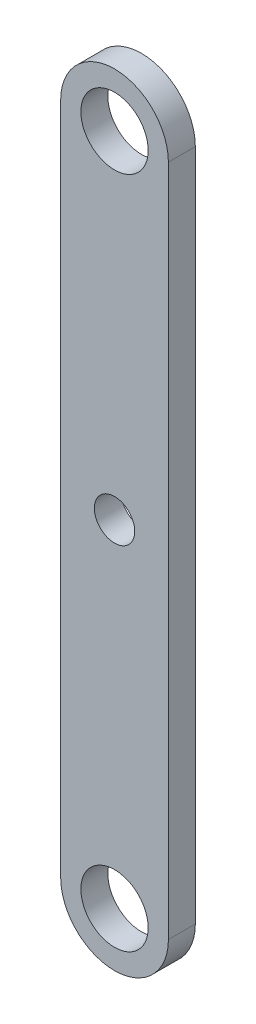
ISO-10303-21;
HEADER;
FILE_DESCRIPTION(('STEP AP214'),'2;1');
FILE_NAME('part.step','',(''),(''),'','','');
FILE_SCHEMA(('AUTOMOTIVE_DESIGN { 1 0 10303 214 1 1 1 1 }'));
ENDSEC;
DATA;
#1=APPLICATION_CONTEXT('core data for automotive mechanical design processes');
#2=APPLICATION_PROTOCOL_DEFINITION('international standard','automotive_design',2000,#1);
#3=PRODUCT_CONTEXT('',#1,'mechanical');
#4=PRODUCT('Part','Part','',(#3));
#5=PRODUCT_RELATED_PRODUCT_CATEGORY('part','',(#4));
#6=PRODUCT_DEFINITION_FORMATION('','',#4);
#7=PRODUCT_DEFINITION_CONTEXT('part definition',#1,'design');
#8=PRODUCT_DEFINITION('design','',#6,#7);
#9=PRODUCT_DEFINITION_SHAPE('','',#8);
#10=(LENGTH_UNIT() NAMED_UNIT(*) SI_UNIT(.MILLI.,.METRE.));
#11=(NAMED_UNIT(*) PLANE_ANGLE_UNIT() SI_UNIT($,.RADIAN.));
#12=(NAMED_UNIT(*) SI_UNIT($,.STERADIAN.) SOLID_ANGLE_UNIT());
#13=UNCERTAINTY_MEASURE_WITH_UNIT(LENGTH_MEASURE(1.E-05),#10,'distance_accuracy_value','');
#14=(GEOMETRIC_REPRESENTATION_CONTEXT(3) GLOBAL_UNCERTAINTY_ASSIGNED_CONTEXT((#13)) GLOBAL_UNIT_ASSIGNED_CONTEXT((#10,
#11,#12)) REPRESENTATION_CONTEXT('',''));
#15=CARTESIAN_POINT('',(0.,0.,0.));
#16=DIRECTION('',(0.,0.,1.));
#17=DIRECTION('',(1.,0.,0.));
#18=AXIS2_PLACEMENT_3D('',#15,#16,#17);
#19=CARTESIAN_POINT('',(0.,0.,10.));
#20=DIRECTION('',(0.,0.,-1.));
#21=DIRECTION('',(-1.,0.,0.));
#22=AXIS2_PLACEMENT_3D('',#19,#20,#21);
#23=CYLINDRICAL_SURFACE('',#22,20.);
#24=CARTESIAN_POINT('',(0.,0.,0.));
#25=DIRECTION('',(0.,0.,1.));
#26=DIRECTION('',(1.,0.,0.));
#27=AXIS2_PLACEMENT_3D('',#24,#25,#26);
#28=CIRCLE('',#27,20.);
#29=CARTESIAN_POINT('',(-20.,0.,0.));
#30=VERTEX_POINT('',#29);
#31=CARTESIAN_POINT('',(20.,0.,0.));
#32=VERTEX_POINT('',#31);
#33=EDGE_CURVE('E96',#30,#32,#28,.T.);
#34=ORIENTED_EDGE('',*,*,#33,.T.);
#35=DIRECTION('',(0.,0.,-1.));
#36=VECTOR('',#35,1.);
#37=CARTESIAN_POINT('',(20.,0.,10.));
#38=LINE('',#37,#36);
#39=CARTESIAN_POINT('',(20.,0.,10.));
#40=VERTEX_POINT('',#39);
#41=EDGE_CURVE('E11',#40,#32,#38,.T.);
#42=ORIENTED_EDGE('',*,*,#41,.F.);
#43=CARTESIAN_POINT('',(0.,0.,10.));
#44=DIRECTION('',(0.,0.,1.));
#45=DIRECTION('',(1.,0.,0.));
#46=AXIS2_PLACEMENT_3D('',#43,#44,#45);
#47=CIRCLE('',#46,20.);
#48=CARTESIAN_POINT('',(-20.,0.,10.));
#49=VERTEX_POINT('',#48);
#50=EDGE_CURVE('E84',#49,#40,#47,.T.);
#51=ORIENTED_EDGE('',*,*,#50,.F.);
#52=DIRECTION('',(0.,0.,-1.));
#53=VECTOR('',#52,1.);
#54=CARTESIAN_POINT('',(-20.,0.,10.));
#55=LINE('',#54,#53);
#56=EDGE_CURVE('E92',#49,#30,#55,.T.);
#57=ORIENTED_EDGE('',*,*,#56,.T.);
#58=EDGE_LOOP('',(#34,#42,#51,#57));
#59=FACE_BOUND('',#58,.T.);
#60=ADVANCED_FACE('F33',(#59),#23,.T.);
#61=CARTESIAN_POINT('',(20.,0.,10.));
#62=DIRECTION('',(-1.,0.,0.));
#63=DIRECTION('',(0.,0.,1.));
#64=AXIS2_PLACEMENT_3D('',#61,#62,#63);
#65=PLANE('',#64);
#66=DIRECTION('',(0.,1.,0.));
#67=VECTOR('',#66,1.);
#68=CARTESIAN_POINT('',(20.,0.,0.));
#69=LINE('',#68,#67);
#70=CARTESIAN_POINT('',(20.,250.,0.));
#71=VERTEX_POINT('',#70);
#72=EDGE_CURVE('E88',#32,#71,#69,.T.);
#73=ORIENTED_EDGE('',*,*,#72,.T.);
#74=DIRECTION('',(0.,0.,-1.));
#75=VECTOR('',#74,1.);
#76=CARTESIAN_POINT('',(20.,250.,10.));
#77=LINE('',#76,#75);
#78=CARTESIAN_POINT('',(20.,250.,10.));
#79=VERTEX_POINT('',#78);
#80=EDGE_CURVE('E41',#79,#71,#77,.T.);
#81=ORIENTED_EDGE('',*,*,#80,.F.);
#82=DIRECTION('',(0.,1.,0.));
#83=VECTOR('',#82,1.);
#84=CARTESIAN_POINT('',(20.,0.,10.));
#85=LINE('',#84,#83);
#86=EDGE_CURVE('E79',#40,#79,#85,.T.);
#87=ORIENTED_EDGE('',*,*,#86,.F.);
#88=ORIENTED_EDGE('',*,*,#41,.T.);
#89=EDGE_LOOP('',(#73,#81,#87,#88));
#90=FACE_BOUND('',#89,.T.);
#91=ADVANCED_FACE('F87',(#90),#65,.F.);
#92=CARTESIAN_POINT('',(0.,250.,10.));
#93=DIRECTION('',(0.,0.,-1.));
#94=DIRECTION('',(-1.,0.,0.));
#95=AXIS2_PLACEMENT_3D('',#92,#93,#94);
#96=CYLINDRICAL_SURFACE('',#95,20.);
#97=CARTESIAN_POINT('',(0.,250.,0.));
#98=DIRECTION('',(0.,0.,1.));
#99=DIRECTION('',(1.,0.,0.));
#100=AXIS2_PLACEMENT_3D('',#97,#98,#99);
#101=CIRCLE('',#100,20.);
#102=CARTESIAN_POINT('',(-20.,250.,0.));
#103=VERTEX_POINT('',#102);
#104=EDGE_CURVE('E66',#71,#103,#101,.T.);
#105=ORIENTED_EDGE('',*,*,#104,.T.);
#106=DIRECTION('',(0.,0.,-1.));
#107=VECTOR('',#106,1.);
#108=CARTESIAN_POINT('',(-20.,250.,10.));
#109=LINE('',#108,#107);
#110=CARTESIAN_POINT('',(-20.,250.,10.));
#111=VERTEX_POINT('',#110);
#112=EDGE_CURVE('E89',#111,#103,#109,.T.);
#113=ORIENTED_EDGE('',*,*,#112,.F.);
#114=CARTESIAN_POINT('',(0.,250.,10.));
#115=DIRECTION('',(0.,0.,1.));
#116=DIRECTION('',(1.,0.,0.));
#117=AXIS2_PLACEMENT_3D('',#114,#115,#116);
#118=CIRCLE('',#117,20.);
#119=EDGE_CURVE('E82',#79,#111,#118,.T.);
#120=ORIENTED_EDGE('',*,*,#119,.F.);
#121=ORIENTED_EDGE('',*,*,#80,.T.);
#122=EDGE_LOOP('',(#105,#113,#120,#121));
#123=FACE_BOUND('',#122,.T.);
#124=ADVANCED_FACE('F90',(#123),#96,.T.);
#125=CARTESIAN_POINT('',(-20.,0.,10.));
#126=DIRECTION('',(1.,0.,0.));
#127=DIRECTION('',(0.,0.,-1.));
#128=AXIS2_PLACEMENT_3D('',#125,#126,#127);
#129=PLANE('',#128);
#130=DIRECTION('',(0.,-1.,0.));
#131=VECTOR('',#130,1.);
#132=CARTESIAN_POINT('',(-20.,0.,0.));
#133=LINE('',#132,#131);
#134=EDGE_CURVE('E72',#103,#30,#133,.T.);
#135=ORIENTED_EDGE('',*,*,#134,.T.);
#136=ORIENTED_EDGE('',*,*,#56,.F.);
#137=DIRECTION('',(0.,-1.,0.));
#138=VECTOR('',#137,1.);
#139=CARTESIAN_POINT('',(-20.,0.,10.));
#140=LINE('',#139,#138);
#141=EDGE_CURVE('E49',#111,#49,#140,.T.);
#142=ORIENTED_EDGE('',*,*,#141,.F.);
#143=ORIENTED_EDGE('',*,*,#112,.T.);
#144=EDGE_LOOP('',(#135,#136,#142,#143));
#145=FACE_BOUND('',#144,.T.);
#146=ADVANCED_FACE('F104',(#145),#129,.F.);
#147=CARTESIAN_POINT('',(0.,0.,10.));
#148=DIRECTION('',(0.,0.,1.));
#149=DIRECTION('',(1.,0.,0.));
#150=AXIS2_PLACEMENT_3D('',#147,#148,#149);
#151=PLANE('',#150);
#152=CARTESIAN_POINT('',(0.,125.,10.));
#153=DIRECTION('',(0.,0.,-1.));
#154=DIRECTION('',(-1.,0.,0.));
#155=AXIS2_PLACEMENT_3D('',#152,#153,#154);
#156=CIRCLE('',#155,7.5);
#157=CARTESIAN_POINT('',(-7.5,125.,10.));
#158=VERTEX_POINT('',#157);
#159=EDGE_CURVE('E114',#158,#158,#156,.T.);
#160=ORIENTED_EDGE('',*,*,#159,.T.);
#161=EDGE_LOOP('',(#160));
#162=FACE_BOUND('',#161,.T.);
#163=CARTESIAN_POINT('',(0.,0.,10.));
#164=DIRECTION('',(0.,0.,-1.));
#165=DIRECTION('',(-1.,0.,0.));
#166=AXIS2_PLACEMENT_3D('',#163,#164,#165);
#167=CIRCLE('',#166,12.5);
#168=CARTESIAN_POINT('',(-12.5,0.,10.));
#169=VERTEX_POINT('',#168);
#170=EDGE_CURVE('E99',#169,#169,#167,.T.);
#171=ORIENTED_EDGE('',*,*,#170,.T.);
#172=EDGE_LOOP('',(#171));
#173=FACE_BOUND('',#172,.T.);
#174=CARTESIAN_POINT('',(0.,250.,10.));
#175=DIRECTION('',(0.,0.,-1.));
#176=DIRECTION('',(-1.,0.,0.));
#177=AXIS2_PLACEMENT_3D('',#174,#175,#176);
#178=CIRCLE('',#177,12.5);
#179=CARTESIAN_POINT('',(-12.5,250.,10.));
#180=VERTEX_POINT('',#179);
#181=EDGE_CURVE('E113',#180,#180,#178,.T.);
#182=ORIENTED_EDGE('',*,*,#181,.T.);
#183=EDGE_LOOP('',(#182));
#184=FACE_BOUND('',#183,.T.);
#185=ORIENTED_EDGE('',*,*,#50,.T.);
#186=ORIENTED_EDGE('',*,*,#86,.T.);
#187=ORIENTED_EDGE('',*,*,#119,.T.);
#188=ORIENTED_EDGE('',*,*,#141,.T.);
#189=EDGE_LOOP('',(#185,#186,#187,#188));
#190=FACE_BOUND('',#189,.T.);
#191=ADVANCED_FACE('F80',(#162,#173,#184,#190),#151,.T.);
#192=CARTESIAN_POINT('',(0.,0.,0.));
#193=DIRECTION('',(0.,0.,1.));
#194=DIRECTION('',(1.,0.,0.));
#195=AXIS2_PLACEMENT_3D('',#192,#193,#194);
#196=PLANE('',#195);
#197=CARTESIAN_POINT('',(0.,125.,0.));
#198=DIRECTION('',(0.,0.,-1.));
#199=DIRECTION('',(-1.,0.,0.));
#200=AXIS2_PLACEMENT_3D('',#197,#198,#199);
#201=CIRCLE('',#200,7.5);
#202=CARTESIAN_POINT('',(-7.5,125.,0.));
#203=VERTEX_POINT('',#202);
#204=EDGE_CURVE('E122',#203,#203,#201,.T.);
#205=ORIENTED_EDGE('',*,*,#204,.F.);
#206=EDGE_LOOP('',(#205));
#207=FACE_BOUND('',#206,.T.);
#208=CARTESIAN_POINT('',(0.,0.,0.));
#209=DIRECTION('',(0.,0.,-1.));
#210=DIRECTION('',(-1.,0.,0.));
#211=AXIS2_PLACEMENT_3D('',#208,#209,#210);
#212=CIRCLE('',#211,12.5);
#213=CARTESIAN_POINT('',(-12.5,0.,0.));
#214=VERTEX_POINT('',#213);
#215=EDGE_CURVE('E117',#214,#214,#212,.T.);
#216=ORIENTED_EDGE('',*,*,#215,.F.);
#217=EDGE_LOOP('',(#216));
#218=FACE_BOUND('',#217,.T.);
#219=CARTESIAN_POINT('',(0.,250.,0.));
#220=DIRECTION('',(0.,0.,-1.));
#221=DIRECTION('',(-1.,0.,0.));
#222=AXIS2_PLACEMENT_3D('',#219,#220,#221);
#223=CIRCLE('',#222,12.5);
#224=CARTESIAN_POINT('',(-12.5,250.,0.));
#225=VERTEX_POINT('',#224);
#226=EDGE_CURVE('E110',#225,#225,#223,.T.);
#227=ORIENTED_EDGE('',*,*,#226,.F.);
#228=EDGE_LOOP('',(#227));
#229=FACE_BOUND('',#228,.T.);
#230=ORIENTED_EDGE('',*,*,#33,.F.);
#231=ORIENTED_EDGE('',*,*,#134,.F.);
#232=ORIENTED_EDGE('',*,*,#104,.F.);
#233=ORIENTED_EDGE('',*,*,#72,.F.);
#234=EDGE_LOOP('',(#230,#231,#232,#233));
#235=FACE_BOUND('',#234,.T.);
#236=ADVANCED_FACE('F107',(#207,#218,#229,#235),#196,.F.);
#237=CARTESIAN_POINT('',(0.,250.,10.));
#238=DIRECTION('',(0.,0.,-1.));
#239=DIRECTION('',(-1.,0.,0.));
#240=AXIS2_PLACEMENT_3D('',#237,#238,#239);
#241=CYLINDRICAL_SURFACE('',#240,12.5);
#242=ORIENTED_EDGE('',*,*,#181,.F.);
#243=EDGE_LOOP('',(#242));
#244=FACE_BOUND('',#243,.T.);
#245=ORIENTED_EDGE('',*,*,#226,.T.);
#246=EDGE_LOOP('',(#245));
#247=FACE_BOUND('',#246,.T.);
#248=ADVANCED_FACE('F139',(#244,#247),#241,.F.);
#249=CARTESIAN_POINT('',(0.,0.,10.));
#250=DIRECTION('',(0.,0.,-1.));
#251=DIRECTION('',(-1.,0.,0.));
#252=AXIS2_PLACEMENT_3D('',#249,#250,#251);
#253=CYLINDRICAL_SURFACE('',#252,12.5);
#254=ORIENTED_EDGE('',*,*,#170,.F.);
#255=EDGE_LOOP('',(#254));
#256=FACE_BOUND('',#255,.T.);
#257=ORIENTED_EDGE('',*,*,#215,.T.);
#258=EDGE_LOOP('',(#257));
#259=FACE_BOUND('',#258,.T.);
#260=ADVANCED_FACE('F133',(#256,#259),#253,.F.);
#261=CARTESIAN_POINT('',(0.,125.,10.));
#262=DIRECTION('',(0.,0.,-1.));
#263=DIRECTION('',(-1.,0.,0.));
#264=AXIS2_PLACEMENT_3D('',#261,#262,#263);
#265=CYLINDRICAL_SURFACE('',#264,7.5);
#266=ORIENTED_EDGE('',*,*,#159,.F.);
#267=EDGE_LOOP('',(#266));
#268=FACE_BOUND('',#267,.T.);
#269=ORIENTED_EDGE('',*,*,#204,.T.);
#270=EDGE_LOOP('',(#269));
#271=FACE_BOUND('',#270,.T.);
#272=ADVANCED_FACE('F130',(#268,#271),#265,.F.);
#273=CLOSED_SHELL('',(#60,#91,#124,#146,#191,#236,#248,#260,#272));
#274=MANIFOLD_SOLID_BREP('B2',#273);
#275=ADVANCED_BREP_SHAPE_REPRESENTATION('',(#18,#274),#14);
#276=SHAPE_DEFINITION_REPRESENTATION(#9,#275);
ENDSEC;
END-ISO-10303-21;
